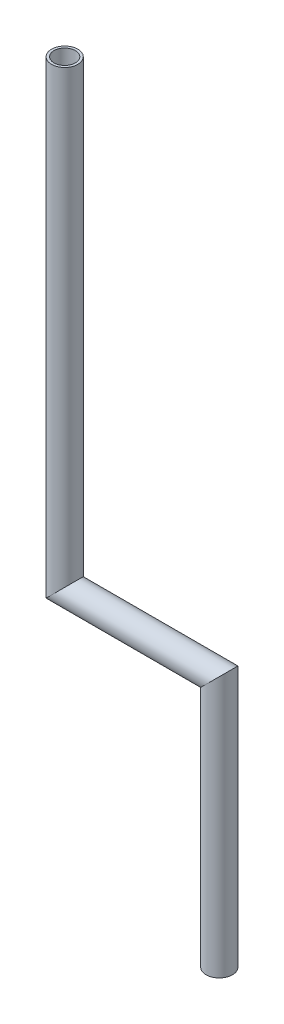
ISO-10303-21;
HEADER;
FILE_DESCRIPTION(('STEP AP214'),'2;1');
FILE_NAME('part.step','',(''),(''),'','','');
FILE_SCHEMA(('AUTOMOTIVE_DESIGN { 1 0 10303 214 1 1 1 1 }'));
ENDSEC;
DATA;
#1=APPLICATION_CONTEXT('core data for automotive mechanical design processes');
#2=APPLICATION_PROTOCOL_DEFINITION('international standard','automotive_design',2000,#1);
#3=PRODUCT_CONTEXT('',#1,'mechanical');
#4=PRODUCT('Part','Part','',(#3));
#5=PRODUCT_RELATED_PRODUCT_CATEGORY('part','',(#4));
#6=PRODUCT_DEFINITION_FORMATION('','',#4);
#7=PRODUCT_DEFINITION_CONTEXT('part definition',#1,'design');
#8=PRODUCT_DEFINITION('design','',#6,#7);
#9=PRODUCT_DEFINITION_SHAPE('','',#8);
#10=(LENGTH_UNIT() NAMED_UNIT(*) SI_UNIT(.MILLI.,.METRE.));
#11=(NAMED_UNIT(*) PLANE_ANGLE_UNIT() SI_UNIT($,.RADIAN.));
#12=(NAMED_UNIT(*) SI_UNIT($,.STERADIAN.) SOLID_ANGLE_UNIT());
#13=UNCERTAINTY_MEASURE_WITH_UNIT(LENGTH_MEASURE(1.E-05),#10,'distance_accuracy_value','');
#14=(GEOMETRIC_REPRESENTATION_CONTEXT(3) GLOBAL_UNCERTAINTY_ASSIGNED_CONTEXT((#13)) GLOBAL_UNIT_ASSIGNED_CONTEXT((#10,
#11,#12)) REPRESENTATION_CONTEXT('',''));
#15=CARTESIAN_POINT('',(0.,0.,0.));
#16=DIRECTION('',(0.,0.,1.));
#17=DIRECTION('',(1.,0.,0.));
#18=AXIS2_PLACEMENT_3D('',#15,#16,#17);
#19=CARTESIAN_POINT('',(100.948472845212,0.,0.));
#20=DIRECTION('',(0.,-1.,0.));
#21=DIRECTION('',(1.,0.,0.));
#22=AXIS2_PLACEMENT_3D('',#19,#20,#21);
#23=CYLINDRICAL_SURFACE('',#22,6.98382971035817);
#24=CARTESIAN_POINT('',(100.948472845212,0.,0.));
#25=DIRECTION('',(0.707106781186548,-0.707106781186548,0.));
#26=DIRECTION('',(0.707106781186548,0.707106781186548,0.));
#27=AXIS2_PLACEMENT_3D('',#24,#25,#26);
#28=ELLIPSE('',#27,9.87662669369268,6.98382971035817);
#29=CARTESIAN_POINT('',(107.93230255557,6.98382971035817,0.));
#30=VERTEX_POINT('',#29);
#31=EDGE_CURVE('E58',#30,#30,#28,.T.);
#32=ORIENTED_EDGE('',*,*,#31,.F.);
#33=EDGE_LOOP('',(#32));
#34=FACE_BOUND('',#33,.T.);
#35=CARTESIAN_POINT('',(100.948472845212,-164.279132507387,0.));
#36=DIRECTION('',(0.,-1.,0.));
#37=DIRECTION('',(1.,0.,0.));
#38=AXIS2_PLACEMENT_3D('',#35,#36,#37);
#39=CIRCLE('',#38,6.98382971035817);
#40=CARTESIAN_POINT('',(107.93230255557,-164.279132507387,0.));
#41=VERTEX_POINT('',#40);
#42=EDGE_CURVE('E13',#41,#41,#39,.F.);
#43=ORIENTED_EDGE('',*,*,#42,.F.);
#44=EDGE_LOOP('',(#43));
#45=FACE_BOUND('',#44,.T.);
#46=ADVANCED_FACE('F42',(#34,#45),#23,.F.);
#47=CARTESIAN_POINT('',(100.948472845212,0.,0.));
#48=DIRECTION('',(0.,-1.,0.));
#49=DIRECTION('',(1.,0.,0.));
#50=AXIS2_PLACEMENT_3D('',#47,#48,#49);
#51=CYLINDRICAL_SURFACE('',#50,8.59029843217949);
#52=CARTESIAN_POINT('',(100.948472845212,0.,0.));
#53=DIRECTION('',(0.707106781186548,-0.707106781186548,0.));
#54=DIRECTION('',(0.707106781186548,0.707106781186548,0.));
#55=AXIS2_PLACEMENT_3D('',#52,#53,#54);
#56=ELLIPSE('',#55,12.1485165476206,8.59029843217949);
#57=CARTESIAN_POINT('',(109.538771277391,8.59029843217949,0.));
#58=VERTEX_POINT('',#57);
#59=EDGE_CURVE('E54',#58,#58,#56,.T.);
#60=ORIENTED_EDGE('',*,*,#59,.T.);
#61=EDGE_LOOP('',(#60));
#62=FACE_BOUND('',#61,.T.);
#63=CARTESIAN_POINT('',(100.948472845212,-164.279132507387,0.));
#64=DIRECTION('',(0.,-1.,0.));
#65=DIRECTION('',(1.,0.,0.));
#66=AXIS2_PLACEMENT_3D('',#63,#64,#65);
#67=CIRCLE('',#66,8.59029843217949);
#68=CARTESIAN_POINT('',(109.538771277391,-164.279132507387,0.));
#69=VERTEX_POINT('',#68);
#70=EDGE_CURVE('E46',#69,#69,#67,.F.);
#71=ORIENTED_EDGE('',*,*,#70,.T.);
#72=EDGE_LOOP('',(#71));
#73=FACE_BOUND('',#72,.T.);
#74=ADVANCED_FACE('F44',(#62,#73),#51,.T.);
#75=CARTESIAN_POINT('',(0.,0.,0.));
#76=DIRECTION('',(1.,0.,0.));
#77=DIRECTION('',(0.,0.,-1.));
#78=AXIS2_PLACEMENT_3D('',#75,#76,#77);
#79=CYLINDRICAL_SURFACE('',#78,8.59029843217949);
#80=CARTESIAN_POINT('',(0.,0.,0.));
#81=DIRECTION('',(0.707106781186548,-0.707106781186548,0.));
#82=DIRECTION('',(0.707106781186548,0.707106781186548,0.));
#83=AXIS2_PLACEMENT_3D('',#80,#81,#82);
#84=ELLIPSE('',#83,12.1485165476206,8.59029843217949);
#85=CARTESIAN_POINT('',(8.59029843217949,8.59029843217949,0.));
#86=VERTEX_POINT('',#85);
#87=EDGE_CURVE('E62',#86,#86,#84,.F.);
#88=ORIENTED_EDGE('',*,*,#87,.F.);
#89=EDGE_LOOP('',(#88));
#90=FACE_BOUND('',#89,.T.);
#91=ORIENTED_EDGE('',*,*,#59,.F.);
#92=EDGE_LOOP('',(#91));
#93=FACE_BOUND('',#92,.T.);
#94=ADVANCED_FACE('F80',(#90,#93),#79,.T.);
#95=CARTESIAN_POINT('',(0.,0.,0.));
#96=DIRECTION('',(1.,0.,0.));
#97=DIRECTION('',(0.,0.,-1.));
#98=AXIS2_PLACEMENT_3D('',#95,#96,#97);
#99=CYLINDRICAL_SURFACE('',#98,6.98382971035817);
#100=CARTESIAN_POINT('',(0.,0.,0.));
#101=DIRECTION('',(0.707106781186548,-0.707106781186548,0.));
#102=DIRECTION('',(0.707106781186548,0.707106781186548,0.));
#103=AXIS2_PLACEMENT_3D('',#100,#101,#102);
#104=ELLIPSE('',#103,9.87662669369268,6.98382971035817);
#105=CARTESIAN_POINT('',(6.98382971035817,6.98382971035817,0.));
#106=VERTEX_POINT('',#105);
#107=EDGE_CURVE('E59',#106,#106,#104,.F.);
#108=ORIENTED_EDGE('',*,*,#107,.T.);
#109=EDGE_LOOP('',(#108));
#110=FACE_BOUND('',#109,.T.);
#111=ORIENTED_EDGE('',*,*,#31,.T.);
#112=EDGE_LOOP('',(#111));
#113=FACE_BOUND('',#112,.T.);
#114=ADVANCED_FACE('F73',(#110,#113),#99,.F.);
#115=CARTESIAN_POINT('',(0.,-24.2970330952412,0.));
#116=DIRECTION('',(0.,1.,0.));
#117=DIRECTION('',(0.,0.,1.));
#118=AXIS2_PLACEMENT_3D('',#115,#116,#117);
#119=CYLINDRICAL_SURFACE('',#118,6.98382971035817);
#120=CARTESIAN_POINT('',(0.,300.,0.));
#121=DIRECTION('',(0.,1.,0.));
#122=DIRECTION('',(0.,0.,1.));
#123=AXIS2_PLACEMENT_3D('',#120,#121,#122);
#124=CIRCLE('',#123,6.98382971035817);
#125=CARTESIAN_POINT('',(0.,300.,6.98382971035817));
#126=VERTEX_POINT('',#125);
#127=EDGE_CURVE('E63',#126,#126,#124,.T.);
#128=ORIENTED_EDGE('',*,*,#127,.T.);
#129=EDGE_LOOP('',(#128));
#130=FACE_BOUND('',#129,.T.);
#131=ORIENTED_EDGE('',*,*,#107,.F.);
#132=EDGE_LOOP('',(#131));
#133=FACE_BOUND('',#132,.T.);
#134=ADVANCED_FACE('F85',(#130,#133),#119,.F.);
#135=CARTESIAN_POINT('',(0.,300.,0.));
#136=DIRECTION('',(0.,1.,0.));
#137=DIRECTION('',(0.,0.,1.));
#138=AXIS2_PLACEMENT_3D('',#135,#136,#137);
#139=PLANE('',#138);
#140=ORIENTED_EDGE('',*,*,#127,.F.);
#141=EDGE_LOOP('',(#140));
#142=FACE_BOUND('',#141,.T.);
#143=CARTESIAN_POINT('',(0.,300.,0.));
#144=DIRECTION('',(0.,1.,0.));
#145=DIRECTION('',(0.,0.,1.));
#146=AXIS2_PLACEMENT_3D('',#143,#144,#145);
#147=CIRCLE('',#146,8.59029843217949);
#148=CARTESIAN_POINT('',(0.,300.,8.59029843217949));
#149=VERTEX_POINT('',#148);
#150=EDGE_CURVE('E66',#149,#149,#147,.T.);
#151=ORIENTED_EDGE('',*,*,#150,.T.);
#152=EDGE_LOOP('',(#151));
#153=FACE_BOUND('',#152,.T.);
#154=ADVANCED_FACE('F92',(#142,#153),#139,.T.);
#155=CARTESIAN_POINT('',(0.,-24.2970330952412,0.));
#156=DIRECTION('',(0.,1.,0.));
#157=DIRECTION('',(0.,0.,1.));
#158=AXIS2_PLACEMENT_3D('',#155,#156,#157);
#159=CYLINDRICAL_SURFACE('',#158,8.59029843217949);
#160=ORIENTED_EDGE('',*,*,#150,.F.);
#161=EDGE_LOOP('',(#160));
#162=FACE_BOUND('',#161,.T.);
#163=ORIENTED_EDGE('',*,*,#87,.T.);
#164=EDGE_LOOP('',(#163));
#165=FACE_BOUND('',#164,.T.);
#166=ADVANCED_FACE('F94',(#162,#165),#159,.T.);
#167=CARTESIAN_POINT('',(100.948472845212,-164.279132507387,0.));
#168=DIRECTION('',(0.,-1.,0.));
#169=DIRECTION('',(1.,0.,0.));
#170=AXIS2_PLACEMENT_3D('',#167,#168,#169);
#171=PLANE('',#170);
#172=ORIENTED_EDGE('',*,*,#70,.F.);
#173=EDGE_LOOP('',(#172));
#174=FACE_BOUND('',#173,.T.);
#175=ORIENTED_EDGE('',*,*,#42,.T.);
#176=EDGE_LOOP('',(#175));
#177=FACE_BOUND('',#176,.T.);
#178=ADVANCED_FACE('F97',(#174,#177),#171,.T.);
#179=CLOSED_SHELL('',(#46,#74,#94,#114,#134,#154,#166,#178));
#180=MANIFOLD_SOLID_BREP('B2',#179);
#181=ADVANCED_BREP_SHAPE_REPRESENTATION('',(#18,#180),#14);
#182=SHAPE_DEFINITION_REPRESENTATION(#9,#181);
ENDSEC;
END-ISO-10303-21;
